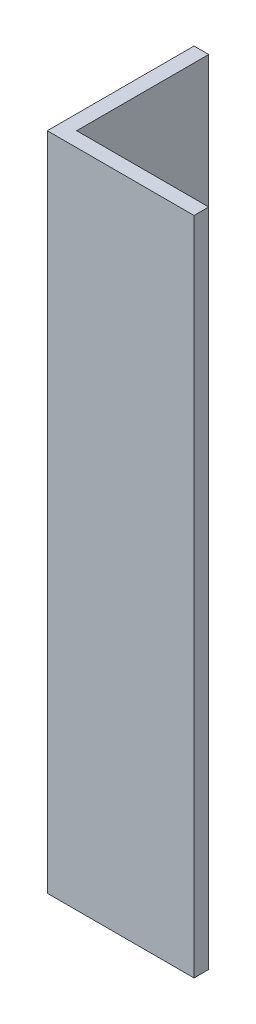
ISO-10303-21;
HEADER;
FILE_DESCRIPTION(('STEP AP214'),'2;1');
FILE_NAME('part.step','',(''),(''),'','','');
FILE_SCHEMA(('AUTOMOTIVE_DESIGN { 1 0 10303 214 1 1 1 1 }'));
ENDSEC;
DATA;
#1=APPLICATION_CONTEXT('core data for automotive mechanical design processes');
#2=APPLICATION_PROTOCOL_DEFINITION('international standard','automotive_design',2000,#1);
#3=PRODUCT_CONTEXT('',#1,'mechanical');
#4=PRODUCT('Part','Part','',(#3));
#5=PRODUCT_RELATED_PRODUCT_CATEGORY('part','',(#4));
#6=PRODUCT_DEFINITION_FORMATION('','',#4);
#7=PRODUCT_DEFINITION_CONTEXT('part definition',#1,'design');
#8=PRODUCT_DEFINITION('design','',#6,#7);
#9=PRODUCT_DEFINITION_SHAPE('','',#8);
#10=(LENGTH_UNIT() NAMED_UNIT(*) SI_UNIT(.MILLI.,.METRE.));
#11=(NAMED_UNIT(*) PLANE_ANGLE_UNIT() SI_UNIT($,.RADIAN.));
#12=(NAMED_UNIT(*) SI_UNIT($,.STERADIAN.) SOLID_ANGLE_UNIT());
#13=UNCERTAINTY_MEASURE_WITH_UNIT(LENGTH_MEASURE(1.E-05),#10,'distance_accuracy_value','');
#14=(GEOMETRIC_REPRESENTATION_CONTEXT(3) GLOBAL_UNCERTAINTY_ASSIGNED_CONTEXT((#13)) GLOBAL_UNIT_ASSIGNED_CONTEXT((#10,
#11,#12)) REPRESENTATION_CONTEXT('',''));
#15=CARTESIAN_POINT('',(0.,0.,0.));
#16=DIRECTION('',(0.,0.,1.));
#17=DIRECTION('',(1.,0.,0.));
#18=AXIS2_PLACEMENT_3D('',#15,#16,#17);
#19=CARTESIAN_POINT('',(0.,90.,0.));
#20=DIRECTION('',(1.,0.,0.));
#21=DIRECTION('',(0.,0.,-1.));
#22=AXIS2_PLACEMENT_3D('',#19,#20,#21);
#23=PLANE('',#22);
#24=DIRECTION('',(0.,0.,1.));
#25=VECTOR('',#24,1.);
#26=CARTESIAN_POINT('',(0.,0.,0.));
#27=LINE('',#26,#25);
#28=CARTESIAN_POINT('',(0.,0.,-20.));
#29=VERTEX_POINT('',#28);
#30=CARTESIAN_POINT('',(0.,0.,0.));
#31=VERTEX_POINT('',#30);
#32=EDGE_CURVE('E128',#29,#31,#27,.T.);
#33=ORIENTED_EDGE('',*,*,#32,.T.);
#34=DIRECTION('',(0.,-1.,0.));
#35=VECTOR('',#34,1.);
#36=CARTESIAN_POINT('',(0.,90.,0.));
#37=LINE('',#36,#35);
#38=CARTESIAN_POINT('',(0.,90.,0.));
#39=VERTEX_POINT('',#38);
#40=EDGE_CURVE('E11',#39,#31,#37,.T.);
#41=ORIENTED_EDGE('',*,*,#40,.F.);
#42=DIRECTION('',(0.,0.,1.));
#43=VECTOR('',#42,1.);
#44=CARTESIAN_POINT('',(0.,90.,0.));
#45=LINE('',#44,#43);
#46=CARTESIAN_POINT('',(0.,90.,-20.));
#47=VERTEX_POINT('',#46);
#48=EDGE_CURVE('E144',#47,#39,#45,.T.);
#49=ORIENTED_EDGE('',*,*,#48,.F.);
#50=DIRECTION('',(0.,-1.,0.));
#51=VECTOR('',#50,1.);
#52=CARTESIAN_POINT('',(0.,90.,-20.));
#53=LINE('',#52,#51);
#54=EDGE_CURVE('E124',#47,#29,#53,.T.);
#55=ORIENTED_EDGE('',*,*,#54,.T.);
#56=EDGE_LOOP('',(#33,#41,#49,#55));
#57=FACE_BOUND('',#56,.T.);
#58=ADVANCED_FACE('F39',(#57),#23,.F.);
#59=CARTESIAN_POINT('',(0.,90.,0.));
#60=DIRECTION('',(0.,0.,-1.));
#61=DIRECTION('',(-1.,0.,0.));
#62=AXIS2_PLACEMENT_3D('',#59,#60,#61);
#63=PLANE('',#62);
#64=DIRECTION('',(1.,0.,0.));
#65=VECTOR('',#64,1.);
#66=CARTESIAN_POINT('',(0.,0.,0.));
#67=LINE('',#66,#65);
#68=CARTESIAN_POINT('',(20.,0.,0.));
#69=VERTEX_POINT('',#68);
#70=EDGE_CURVE('E132',#31,#69,#67,.T.);
#71=ORIENTED_EDGE('',*,*,#70,.T.);
#72=DIRECTION('',(0.,-1.,0.));
#73=VECTOR('',#72,1.);
#74=CARTESIAN_POINT('',(20.,90.,0.));
#75=LINE('',#74,#73);
#76=CARTESIAN_POINT('',(20.,90.,0.));
#77=VERTEX_POINT('',#76);
#78=EDGE_CURVE('E48',#77,#69,#75,.T.);
#79=ORIENTED_EDGE('',*,*,#78,.F.);
#80=DIRECTION('',(1.,0.,0.));
#81=VECTOR('',#80,1.);
#82=CARTESIAN_POINT('',(0.,90.,0.));
#83=LINE('',#82,#81);
#84=EDGE_CURVE('E93',#39,#77,#83,.T.);
#85=ORIENTED_EDGE('',*,*,#84,.F.);
#86=ORIENTED_EDGE('',*,*,#40,.T.);
#87=EDGE_LOOP('',(#71,#79,#85,#86));
#88=FACE_BOUND('',#87,.T.);
#89=ADVANCED_FACE('F172',(#88),#63,.F.);
#90=CARTESIAN_POINT('',(20.,90.,0.));
#91=DIRECTION('',(-1.,0.,0.));
#92=DIRECTION('',(0.,0.,1.));
#93=AXIS2_PLACEMENT_3D('',#90,#91,#92);
#94=PLANE('',#93);
#95=DIRECTION('',(0.,0.,-1.));
#96=VECTOR('',#95,1.);
#97=CARTESIAN_POINT('',(20.,0.,0.));
#98=LINE('',#97,#96);
#99=CARTESIAN_POINT('',(20.,0.,-2.));
#100=VERTEX_POINT('',#99);
#101=EDGE_CURVE('E135',#69,#100,#98,.T.);
#102=ORIENTED_EDGE('',*,*,#101,.T.);
#103=DIRECTION('',(0.,-1.,0.));
#104=VECTOR('',#103,1.);
#105=CARTESIAN_POINT('',(20.,90.,-2.));
#106=LINE('',#105,#104);
#107=CARTESIAN_POINT('',(20.,90.,-2.));
#108=VERTEX_POINT('',#107);
#109=EDGE_CURVE('E117',#108,#100,#106,.T.);
#110=ORIENTED_EDGE('',*,*,#109,.F.);
#111=DIRECTION('',(0.,0.,-1.));
#112=VECTOR('',#111,1.);
#113=CARTESIAN_POINT('',(20.,90.,0.));
#114=LINE('',#113,#112);
#115=EDGE_CURVE('E106',#77,#108,#114,.T.);
#116=ORIENTED_EDGE('',*,*,#115,.F.);
#117=ORIENTED_EDGE('',*,*,#78,.T.);
#118=EDGE_LOOP('',(#102,#110,#116,#117));
#119=FACE_BOUND('',#118,.T.);
#120=ADVANCED_FACE('F154',(#119),#94,.F.);
#121=CARTESIAN_POINT('',(20.,90.,-2.));
#122=DIRECTION('',(0.,0.,1.));
#123=DIRECTION('',(1.,0.,0.));
#124=AXIS2_PLACEMENT_3D('',#121,#122,#123);
#125=PLANE('',#124);
#126=DIRECTION('',(-1.,0.,0.));
#127=VECTOR('',#126,1.);
#128=CARTESIAN_POINT('',(20.,0.,-2.));
#129=LINE('',#128,#127);
#130=CARTESIAN_POINT('',(2.,0.,-2.));
#131=VERTEX_POINT('',#130);
#132=EDGE_CURVE('E115',#100,#131,#129,.T.);
#133=ORIENTED_EDGE('',*,*,#132,.T.);
#134=DIRECTION('',(0.,-1.,0.));
#135=VECTOR('',#134,1.);
#136=CARTESIAN_POINT('',(2.,90.,-2.));
#137=LINE('',#136,#135);
#138=CARTESIAN_POINT('',(2.,90.,-2.));
#139=VERTEX_POINT('',#138);
#140=EDGE_CURVE('E112',#139,#131,#137,.T.);
#141=ORIENTED_EDGE('',*,*,#140,.F.);
#142=DIRECTION('',(-1.,0.,0.));
#143=VECTOR('',#142,1.);
#144=CARTESIAN_POINT('',(20.,90.,-2.));
#145=LINE('',#144,#143);
#146=EDGE_CURVE('E100',#108,#139,#145,.T.);
#147=ORIENTED_EDGE('',*,*,#146,.F.);
#148=ORIENTED_EDGE('',*,*,#109,.T.);
#149=EDGE_LOOP('',(#133,#141,#147,#148));
#150=FACE_BOUND('',#149,.T.);
#151=ADVANCED_FACE('F113',(#150),#125,.F.);
#152=CARTESIAN_POINT('',(2.,90.,-20.));
#153=DIRECTION('',(-1.,0.,0.));
#154=DIRECTION('',(0.,0.,1.));
#155=AXIS2_PLACEMENT_3D('',#152,#153,#154);
#156=PLANE('',#155);
#157=DIRECTION('',(0.,0.,-1.));
#158=VECTOR('',#157,1.);
#159=CARTESIAN_POINT('',(2.,0.,-20.));
#160=LINE('',#159,#158);
#161=CARTESIAN_POINT('',(2.,0.,-20.));
#162=VERTEX_POINT('',#161);
#163=EDGE_CURVE('E79',#131,#162,#160,.T.);
#164=ORIENTED_EDGE('',*,*,#163,.T.);
#165=DIRECTION('',(0.,-1.,0.));
#166=VECTOR('',#165,1.);
#167=CARTESIAN_POINT('',(2.,90.,-20.));
#168=LINE('',#167,#166);
#169=CARTESIAN_POINT('',(2.,90.,-20.));
#170=VERTEX_POINT('',#169);
#171=EDGE_CURVE('E118',#170,#162,#168,.T.);
#172=ORIENTED_EDGE('',*,*,#171,.F.);
#173=DIRECTION('',(0.,0.,-1.));
#174=VECTOR('',#173,1.);
#175=CARTESIAN_POINT('',(2.,90.,-20.));
#176=LINE('',#175,#174);
#177=EDGE_CURVE('E104',#139,#170,#176,.T.);
#178=ORIENTED_EDGE('',*,*,#177,.F.);
#179=ORIENTED_EDGE('',*,*,#140,.T.);
#180=EDGE_LOOP('',(#164,#172,#178,#179));
#181=FACE_BOUND('',#180,.T.);
#182=ADVANCED_FACE('F120',(#181),#156,.F.);
#183=CARTESIAN_POINT('',(0.,90.,-20.));
#184=DIRECTION('',(0.,0.,1.));
#185=DIRECTION('',(1.,0.,0.));
#186=AXIS2_PLACEMENT_3D('',#183,#184,#185);
#187=PLANE('',#186);
#188=DIRECTION('',(-1.,0.,0.));
#189=VECTOR('',#188,1.);
#190=CARTESIAN_POINT('',(0.,0.,-20.));
#191=LINE('',#190,#189);
#192=EDGE_CURVE('E85',#162,#29,#191,.T.);
#193=ORIENTED_EDGE('',*,*,#192,.T.);
#194=ORIENTED_EDGE('',*,*,#54,.F.);
#195=DIRECTION('',(-1.,0.,0.));
#196=VECTOR('',#195,1.);
#197=CARTESIAN_POINT('',(0.,90.,-20.));
#198=LINE('',#197,#196);
#199=EDGE_CURVE('E56',#170,#47,#198,.T.);
#200=ORIENTED_EDGE('',*,*,#199,.F.);
#201=ORIENTED_EDGE('',*,*,#171,.T.);
#202=EDGE_LOOP('',(#193,#194,#200,#201));
#203=FACE_BOUND('',#202,.T.);
#204=ADVANCED_FACE('F161',(#203),#187,.F.);
#205=CARTESIAN_POINT('',(0.,90.,0.));
#206=DIRECTION('',(0.,-1.,0.));
#207=DIRECTION('',(0.,0.,-1.));
#208=AXIS2_PLACEMENT_3D('',#205,#206,#207);
#209=PLANE('',#208);
#210=ORIENTED_EDGE('',*,*,#48,.T.);
#211=ORIENTED_EDGE('',*,*,#84,.T.);
#212=ORIENTED_EDGE('',*,*,#115,.T.);
#213=ORIENTED_EDGE('',*,*,#146,.T.);
#214=ORIENTED_EDGE('',*,*,#177,.T.);
#215=ORIENTED_EDGE('',*,*,#199,.T.);
#216=EDGE_LOOP('',(#210,#211,#212,#213,#214,#215));
#217=FACE_BOUND('',#216,.T.);
#218=ADVANCED_FACE('F102',(#217),#209,.F.);
#219=CARTESIAN_POINT('',(0.,0.,0.));
#220=DIRECTION('',(0.,-1.,0.));
#221=DIRECTION('',(0.,0.,-1.));
#222=AXIS2_PLACEMENT_3D('',#219,#220,#221);
#223=PLANE('',#222);
#224=ORIENTED_EDGE('',*,*,#32,.F.);
#225=ORIENTED_EDGE('',*,*,#192,.F.);
#226=ORIENTED_EDGE('',*,*,#163,.F.);
#227=ORIENTED_EDGE('',*,*,#132,.F.);
#228=ORIENTED_EDGE('',*,*,#101,.F.);
#229=ORIENTED_EDGE('',*,*,#70,.F.);
#230=EDGE_LOOP('',(#224,#225,#226,#227,#228,#229));
#231=FACE_BOUND('',#230,.T.);
#232=ADVANCED_FACE('F157',(#231),#223,.T.);
#233=CLOSED_SHELL('',(#58,#89,#120,#151,#182,#204,#218,#232));
#234=MANIFOLD_SOLID_BREP('B2',#233);
#235=ADVANCED_BREP_SHAPE_REPRESENTATION('',(#18,#234),#14);
#236=SHAPE_DEFINITION_REPRESENTATION(#9,#235);
ENDSEC;
END-ISO-10303-21;
